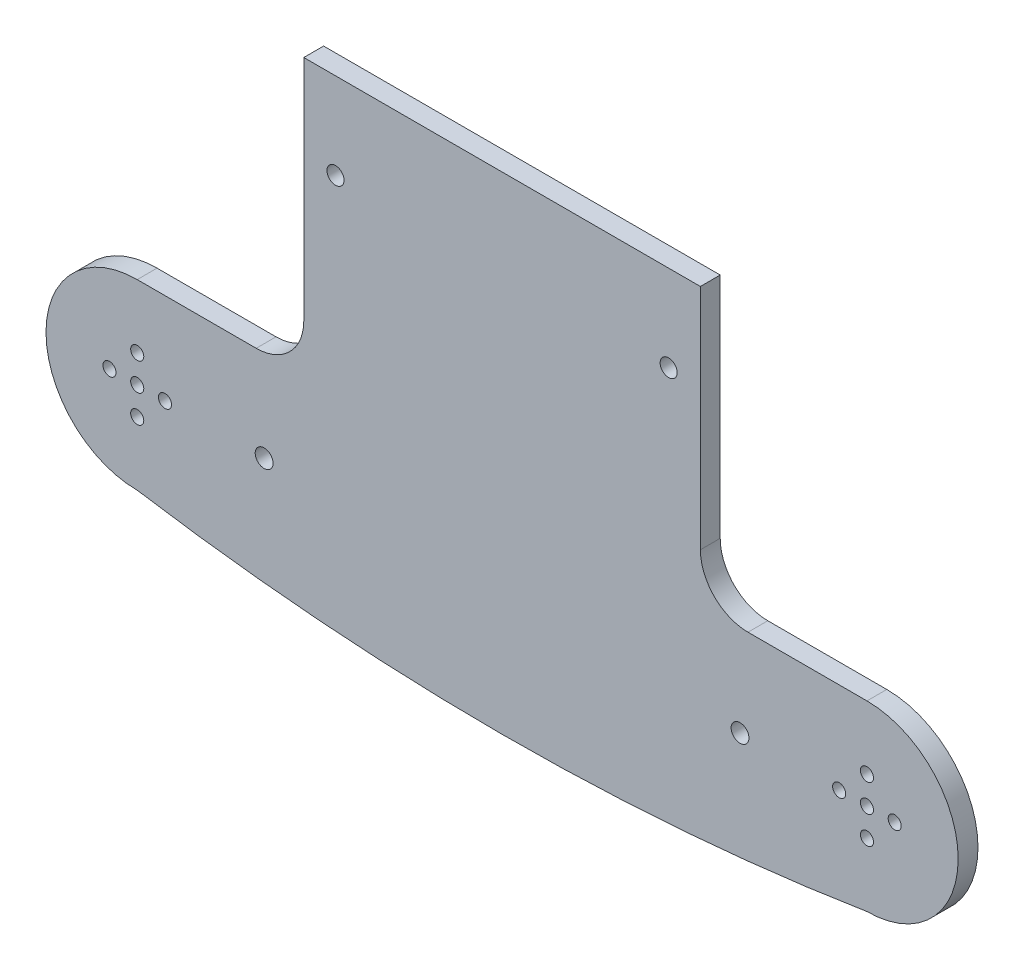
ISO-10303-21;
HEADER;
FILE_DESCRIPTION(('STEP AP214'),'2;1');
FILE_NAME('part.step','',(''),(''),'','','');
FILE_SCHEMA(('AUTOMOTIVE_DESIGN { 1 0 10303 214 1 1 1 1 }'));
ENDSEC;
DATA;
#1=APPLICATION_CONTEXT('core data for automotive mechanical design processes');
#2=APPLICATION_PROTOCOL_DEFINITION('international standard','automotive_design',2000,#1);
#3=PRODUCT_CONTEXT('',#1,'mechanical');
#4=PRODUCT('Part','Part','',(#3));
#5=PRODUCT_RELATED_PRODUCT_CATEGORY('part','',(#4));
#6=PRODUCT_DEFINITION_FORMATION('','',#4);
#7=PRODUCT_DEFINITION_CONTEXT('part definition',#1,'design');
#8=PRODUCT_DEFINITION('design','',#6,#7);
#9=PRODUCT_DEFINITION_SHAPE('','',#8);
#10=(LENGTH_UNIT() NAMED_UNIT(*) SI_UNIT(.MILLI.,.METRE.));
#11=(NAMED_UNIT(*) PLANE_ANGLE_UNIT() SI_UNIT($,.RADIAN.));
#12=(NAMED_UNIT(*) SI_UNIT($,.STERADIAN.) SOLID_ANGLE_UNIT());
#13=UNCERTAINTY_MEASURE_WITH_UNIT(LENGTH_MEASURE(1.E-05),#10,'distance_accuracy_value','');
#14=(GEOMETRIC_REPRESENTATION_CONTEXT(3) GLOBAL_UNCERTAINTY_ASSIGNED_CONTEXT((#13)) GLOBAL_UNIT_ASSIGNED_CONTEXT((#10,
#11,#12)) REPRESENTATION_CONTEXT('',''));
#15=CARTESIAN_POINT('',(0.,0.,0.));
#16=DIRECTION('',(0.,0.,1.));
#17=DIRECTION('',(1.,0.,0.));
#18=AXIS2_PLACEMENT_3D('',#15,#16,#17);
#19=CARTESIAN_POINT('',(-70.9669552143138,-59.5010284958712,-0.00999999999999959));
#20=DIRECTION('',(0.,-1.,0.));
#21=DIRECTION('',(0.,0.,-1.));
#22=AXIS2_PLACEMENT_3D('',#19,#20,#21);
#23=PLANE('',#22);
#24=DIRECTION('',(1.,0.,0.));
#25=VECTOR('',#24,1.);
#26=CARTESIAN_POINT('',(-92.,-59.5010284958712,5.));
#27=LINE('',#26,#25);
#28=CARTESIAN_POINT('',(-50.,-59.5010284958712,5.));
#29=VERTEX_POINT('',#28);
#30=CARTESIAN_POINT('',(50.,-59.5010284958712,5.));
#31=VERTEX_POINT('',#30);
#32=EDGE_CURVE('E300',#29,#31,#27,.T.);
#33=ORIENTED_EDGE('',*,*,#32,.T.);
#34=DIRECTION('',(0.,0.,1.));
#35=VECTOR('',#34,1.);
#36=CARTESIAN_POINT('',(50.,-59.5010284958712,5.));
#37=LINE('',#36,#35);
#38=CARTESIAN_POINT('',(50.,-59.5010284958712,0.));
#39=VERTEX_POINT('',#38);
#40=EDGE_CURVE('E288',#39,#31,#37,.T.);
#41=ORIENTED_EDGE('',*,*,#40,.F.);
#42=DIRECTION('',(1.,0.,0.));
#43=VECTOR('',#42,1.);
#44=CARTESIAN_POINT('',(-92.,-59.5010284958712,0.));
#45=LINE('',#44,#43);
#46=CARTESIAN_POINT('',(-50.,-59.5010284958712,0.));
#47=VERTEX_POINT('',#46);
#48=EDGE_CURVE('E296',#47,#39,#45,.T.);
#49=ORIENTED_EDGE('',*,*,#48,.F.);
#50=DIRECTION('',(0.,0.,-1.));
#51=VECTOR('',#50,1.);
#52=CARTESIAN_POINT('',(-50.,-59.5010284958712,5.));
#53=LINE('',#52,#51);
#54=EDGE_CURVE('E293',#29,#47,#53,.T.);
#55=ORIENTED_EDGE('',*,*,#54,.F.);
#56=EDGE_LOOP('',(#33,#41,#49,#55));
#57=FACE_BOUND('',#56,.T.);
#58=ADVANCED_FACE('F43',(#57),#23,.F.);
#59=CARTESIAN_POINT('',(-92.,0.,5.));
#60=DIRECTION('',(0.,0.,1.));
#61=DIRECTION('',(1.,0.,0.));
#62=AXIS2_PLACEMENT_3D('',#59,#60,#61);
#63=PLANE('',#62);
#64=ORIENTED_EDGE('',*,*,#32,.F.);
#65=DIRECTION('',(0.,-1.,0.));
#66=VECTOR('',#65,1.);
#67=CARTESIAN_POINT('',(-50.,-116.998971504128,5.));
#68=LINE('',#67,#66);
#69=CARTESIAN_POINT('',(-50.,-116.998971504128,5.));
#70=VERTEX_POINT('',#69);
#71=EDGE_CURVE('E97',#29,#70,#68,.T.);
#72=ORIENTED_EDGE('',*,*,#71,.T.);
#73=CARTESIAN_POINT('',(-62.,-116.998971504128,5.));
#74=DIRECTION('',(0.,0.,-1.));
#75=DIRECTION('',(1.,0.,0.));
#76=AXIS2_PLACEMENT_3D('',#73,#74,#75);
#77=CIRCLE('',#76,12.);
#78=CARTESIAN_POINT('',(-62.,-128.998971504128,5.));
#79=VERTEX_POINT('',#78);
#80=EDGE_CURVE('E92',#70,#79,#77,.T.);
#81=ORIENTED_EDGE('',*,*,#80,.T.);
#82=DIRECTION('',(-1.,0.,0.));
#83=VECTOR('',#82,1.);
#84=CARTESIAN_POINT('',(-62.,-128.998971504128,5.));
#85=LINE('',#84,#83);
#86=CARTESIAN_POINT('',(-92.,-128.998971504128,5.));
#87=VERTEX_POINT('',#86);
#88=EDGE_CURVE('E176',#79,#87,#85,.T.);
#89=ORIENTED_EDGE('',*,*,#88,.T.);
#90=CARTESIAN_POINT('',(-92.,-151.999999999999,5.));
#91=DIRECTION('',(0.,0.,1.));
#92=DIRECTION('',(-1.,0.,0.));
#93=AXIS2_PLACEMENT_3D('',#90,#91,#92);
#94=CIRCLE('',#93,23.0010284958712);
#95=CARTESIAN_POINT('',(-92.,-175.00102849587,5.));
#96=VERTEX_POINT('',#95);
#97=EDGE_CURVE('E143',#87,#96,#94,.T.);
#98=ORIENTED_EDGE('',*,*,#97,.T.);
#99=CARTESIAN_POINT('',(-1.11022302462516E-13,400.845641933042,5.));
#100=DIRECTION('',(0.,0.,1.));
#101=DIRECTION('',(1.,0.,0.));
#102=AXIS2_PLACEMENT_3D('',#99,#100,#101);
#103=CIRCLE('',#102,583.149541579229);
#104=CARTESIAN_POINT('',(91.9999999999998,-175.001028495871,5.));
#105=VERTEX_POINT('',#104);
#106=EDGE_CURVE('E171',#96,#105,#103,.T.);
#107=ORIENTED_EDGE('',*,*,#106,.T.);
#108=CARTESIAN_POINT('',(92.,-151.999999999999,5.));
#109=DIRECTION('',(0.,0.,1.));
#110=DIRECTION('',(1.,0.,0.));
#111=AXIS2_PLACEMENT_3D('',#108,#109,#110);
#112=CIRCLE('',#111,23.0010284958712);
#113=CARTESIAN_POINT('',(92.,-128.998971504128,5.));
#114=VERTEX_POINT('',#113);
#115=EDGE_CURVE('E168',#105,#114,#112,.T.);
#116=ORIENTED_EDGE('',*,*,#115,.T.);
#117=DIRECTION('',(-1.,0.,0.));
#118=VECTOR('',#117,1.);
#119=CARTESIAN_POINT('',(62.,-128.998971504128,5.));
#120=LINE('',#119,#118);
#121=CARTESIAN_POINT('',(62.,-128.998971504128,5.));
#122=VERTEX_POINT('',#121);
#123=EDGE_CURVE('E164',#114,#122,#120,.T.);
#124=ORIENTED_EDGE('',*,*,#123,.T.);
#125=CARTESIAN_POINT('',(62.,-116.998971504128,5.));
#126=DIRECTION('',(0.,0.,-1.));
#127=DIRECTION('',(-1.,0.,0.));
#128=AXIS2_PLACEMENT_3D('',#125,#126,#127);
#129=CIRCLE('',#128,12.);
#130=CARTESIAN_POINT('',(50.,-116.998971504128,5.));
#131=VERTEX_POINT('',#130);
#132=EDGE_CURVE('E161',#122,#131,#129,.T.);
#133=ORIENTED_EDGE('',*,*,#132,.T.);
#134=DIRECTION('',(0.,1.,0.));
#135=VECTOR('',#134,1.);
#136=CARTESIAN_POINT('',(50.,-116.998971504128,5.));
#137=LINE('',#136,#135);
#138=EDGE_CURVE('E165',#131,#31,#137,.T.);
#139=ORIENTED_EDGE('',*,*,#138,.T.);
#140=EDGE_LOOP('',(#64,#72,#81,#89,#98,#107,#116,#124,#133,#139));
#141=FACE_BOUND('',#140,.T.);
#142=CARTESIAN_POINT('',(-42.,-81.248971504128,5.));
#143=DIRECTION('',(0.,0.,1.));
#144=DIRECTION('',(-1.,0.,0.));
#145=AXIS2_PLACEMENT_3D('',#142,#143,#144);
#146=CIRCLE('',#145,2.15);
#147=CARTESIAN_POINT('',(-44.15,-81.248971504128,5.));
#148=VERTEX_POINT('',#147);
#149=EDGE_CURVE('E274',#148,#148,#146,.T.);
#150=ORIENTED_EDGE('',*,*,#149,.F.);
#151=EDGE_LOOP('',(#150));
#152=FACE_BOUND('',#151,.T.);
#153=CARTESIAN_POINT('',(42.,-81.248971504128,5.));
#154=DIRECTION('',(0.,0.,1.));
#155=DIRECTION('',(1.,0.,0.));
#156=AXIS2_PLACEMENT_3D('',#153,#154,#155);
#157=CIRCLE('',#156,2.15);
#158=CARTESIAN_POINT('',(44.15,-81.248971504128,5.));
#159=VERTEX_POINT('',#158);
#160=EDGE_CURVE('E54',#159,#159,#157,.T.);
#161=ORIENTED_EDGE('',*,*,#160,.F.);
#162=EDGE_LOOP('',(#161));
#163=FACE_BOUND('',#162,.T.);
#164=CARTESIAN_POINT('',(60.,-151.999999999999,5.));
#165=DIRECTION('',(0.,0.,1.));
#166=DIRECTION('',(-1.,0.,0.));
#167=AXIS2_PLACEMENT_3D('',#164,#165,#166);
#168=CIRCLE('',#167,2.25);
#169=CARTESIAN_POINT('',(57.75,-151.999999999999,5.));
#170=VERTEX_POINT('',#169);
#171=EDGE_CURVE('E266',#170,#170,#168,.T.);
#172=ORIENTED_EDGE('',*,*,#171,.F.);
#173=EDGE_LOOP('',(#172));
#174=FACE_BOUND('',#173,.T.);
#175=CARTESIAN_POINT('',(-60.,-151.999999999999,5.));
#176=DIRECTION('',(0.,0.,1.));
#177=DIRECTION('',(1.,0.,0.));
#178=AXIS2_PLACEMENT_3D('',#175,#176,#177);
#179=CIRCLE('',#178,2.25);
#180=CARTESIAN_POINT('',(-57.75,-151.999999999999,5.));
#181=VERTEX_POINT('',#180);
#182=EDGE_CURVE('E262',#181,#181,#179,.T.);
#183=ORIENTED_EDGE('',*,*,#182,.F.);
#184=EDGE_LOOP('',(#183));
#185=FACE_BOUND('',#184,.T.);
#186=CARTESIAN_POINT('',(-92.,-159.00102849587,5.));
#187=DIRECTION('',(0.,0.,1.));
#188=DIRECTION('',(-1.,0.,0.));
#189=AXIS2_PLACEMENT_3D('',#186,#187,#188);
#190=CIRCLE('',#189,1.65000000000001);
#191=CARTESIAN_POINT('',(-93.65,-159.00102849587,5.));
#192=VERTEX_POINT('',#191);
#193=EDGE_CURVE('E242',#192,#192,#190,.T.);
#194=ORIENTED_EDGE('',*,*,#193,.F.);
#195=EDGE_LOOP('',(#194));
#196=FACE_BOUND('',#195,.T.);
#197=CARTESIAN_POINT('',(-92.,-144.998971504128,5.));
#198=DIRECTION('',(0.,0.,1.));
#199=DIRECTION('',(-1.,0.,0.));
#200=AXIS2_PLACEMENT_3D('',#197,#198,#199);
#201=CIRCLE('',#200,1.65000000000001);
#202=CARTESIAN_POINT('',(-93.65,-144.998971504128,5.));
#203=VERTEX_POINT('',#202);
#204=EDGE_CURVE('E226',#203,#203,#201,.T.);
#205=ORIENTED_EDGE('',*,*,#204,.F.);
#206=EDGE_LOOP('',(#205));
#207=FACE_BOUND('',#206,.T.);
#208=CARTESIAN_POINT('',(99.0010284958712,-151.999999999999,5.));
#209=DIRECTION('',(0.,0.,1.));
#210=DIRECTION('',(1.,0.,0.));
#211=AXIS2_PLACEMENT_3D('',#208,#209,#210);
#212=CIRCLE('',#211,1.65000000000001);
#213=CARTESIAN_POINT('',(100.651028495871,-151.999999999999,5.));
#214=VERTEX_POINT('',#213);
#215=EDGE_CURVE('E210',#214,#214,#212,.T.);
#216=ORIENTED_EDGE('',*,*,#215,.F.);
#217=EDGE_LOOP('',(#216));
#218=FACE_BOUND('',#217,.T.);
#219=CARTESIAN_POINT('',(84.9989715041288,-151.999999999999,5.));
#220=DIRECTION('',(0.,0.,1.));
#221=DIRECTION('',(1.,0.,0.));
#222=AXIS2_PLACEMENT_3D('',#219,#220,#221);
#223=CIRCLE('',#222,1.65000000000001);
#224=CARTESIAN_POINT('',(86.6489715041288,-151.999999999999,5.));
#225=VERTEX_POINT('',#224);
#226=EDGE_CURVE('E194',#225,#225,#223,.T.);
#227=ORIENTED_EDGE('',*,*,#226,.F.);
#228=EDGE_LOOP('',(#227));
#229=FACE_BOUND('',#228,.T.);
#230=CARTESIAN_POINT('',(-92.,-151.999999999999,5.));
#231=DIRECTION('',(0.,0.,1.));
#232=DIRECTION('',(-1.,0.,0.));
#233=AXIS2_PLACEMENT_3D('',#230,#231,#232);
#234=CIRCLE('',#233,1.65);
#235=CARTESIAN_POINT('',(-93.65,-151.999999999999,5.));
#236=VERTEX_POINT('',#235);
#237=EDGE_CURVE('E186',#236,#236,#234,.T.);
#238=ORIENTED_EDGE('',*,*,#237,.F.);
#239=EDGE_LOOP('',(#238));
#240=FACE_BOUND('',#239,.T.);
#241=CARTESIAN_POINT('',(92.,-151.999999999999,5.));
#242=DIRECTION('',(0.,0.,1.));
#243=DIRECTION('',(1.,0.,0.));
#244=AXIS2_PLACEMENT_3D('',#241,#242,#243);
#245=CIRCLE('',#244,1.65);
#246=CARTESIAN_POINT('',(93.65,-151.999999999999,5.));
#247=VERTEX_POINT('',#246);
#248=EDGE_CURVE('E185',#247,#247,#245,.T.);
#249=ORIENTED_EDGE('',*,*,#248,.F.);
#250=EDGE_LOOP('',(#249));
#251=FACE_BOUND('',#250,.T.);
#252=CARTESIAN_POINT('',(92.,-159.00102849587,5.));
#253=DIRECTION('',(0.,0.,1.));
#254=DIRECTION('',(1.,0.,0.));
#255=AXIS2_PLACEMENT_3D('',#252,#253,#254);
#256=CIRCLE('',#255,1.65000000000001);
#257=CARTESIAN_POINT('',(93.65,-159.00102849587,5.));
#258=VERTEX_POINT('',#257);
#259=EDGE_CURVE('E202',#258,#258,#256,.T.);
#260=ORIENTED_EDGE('',*,*,#259,.F.);
#261=EDGE_LOOP('',(#260));
#262=FACE_BOUND('',#261,.T.);
#263=CARTESIAN_POINT('',(92.,-144.998971504128,5.));
#264=DIRECTION('',(0.,0.,1.));
#265=DIRECTION('',(1.,0.,0.));
#266=AXIS2_PLACEMENT_3D('',#263,#264,#265);
#267=CIRCLE('',#266,1.65000000000001);
#268=CARTESIAN_POINT('',(93.65,-144.998971504128,5.));
#269=VERTEX_POINT('',#268);
#270=EDGE_CURVE('E218',#269,#269,#267,.T.);
#271=ORIENTED_EDGE('',*,*,#270,.F.);
#272=EDGE_LOOP('',(#271));
#273=FACE_BOUND('',#272,.T.);
#274=CARTESIAN_POINT('',(-99.0010284958712,-151.999999999999,5.));
#275=DIRECTION('',(0.,0.,1.));
#276=DIRECTION('',(-1.,0.,0.));
#277=AXIS2_PLACEMENT_3D('',#274,#275,#276);
#278=CIRCLE('',#277,1.65000000000001);
#279=CARTESIAN_POINT('',(-100.651028495871,-151.999999999999,5.));
#280=VERTEX_POINT('',#279);
#281=EDGE_CURVE('E234',#280,#280,#278,.T.);
#282=ORIENTED_EDGE('',*,*,#281,.F.);
#283=EDGE_LOOP('',(#282));
#284=FACE_BOUND('',#283,.T.);
#285=CARTESIAN_POINT('',(-84.9989715041288,-151.999999999999,5.));
#286=DIRECTION('',(0.,0.,1.));
#287=DIRECTION('',(-1.,0.,0.));
#288=AXIS2_PLACEMENT_3D('',#285,#286,#287);
#289=CIRCLE('',#288,1.65000000000001);
#290=CARTESIAN_POINT('',(-86.6489715041288,-151.999999999999,5.));
#291=VERTEX_POINT('',#290);
#292=EDGE_CURVE('E250',#291,#291,#289,.T.);
#293=ORIENTED_EDGE('',*,*,#292,.F.);
#294=EDGE_LOOP('',(#293));
#295=FACE_BOUND('',#294,.T.);
#296=ADVANCED_FACE('F350',(#141,#152,#163,#174,#185,#196,#207,#218,#229,#240,#251,#262,#273,
#284,#295),#63,.T.);
#297=CARTESIAN_POINT('',(-92.,0.,0.));
#298=DIRECTION('',(0.,0.,1.));
#299=DIRECTION('',(1.,0.,0.));
#300=AXIS2_PLACEMENT_3D('',#297,#298,#299);
#301=PLANE('',#300);
#302=CARTESIAN_POINT('',(-42.,-81.248971504128,0.));
#303=DIRECTION('',(0.,0.,1.));
#304=DIRECTION('',(-1.,0.,0.));
#305=AXIS2_PLACEMENT_3D('',#302,#303,#304);
#306=CIRCLE('',#305,2.15);
#307=CARTESIAN_POINT('',(-44.15,-81.248971504128,0.));
#308=VERTEX_POINT('',#307);
#309=EDGE_CURVE('E281',#308,#308,#306,.T.);
#310=ORIENTED_EDGE('',*,*,#309,.T.);
#311=EDGE_LOOP('',(#310));
#312=FACE_BOUND('',#311,.T.);
#313=CARTESIAN_POINT('',(42.,-81.248971504128,0.));
#314=DIRECTION('',(0.,0.,1.));
#315=DIRECTION('',(1.,0.,0.));
#316=AXIS2_PLACEMENT_3D('',#313,#314,#315);
#317=CIRCLE('',#316,2.15);
#318=CARTESIAN_POINT('',(44.15,-81.248971504128,0.));
#319=VERTEX_POINT('',#318);
#320=EDGE_CURVE('E11',#319,#319,#317,.T.);
#321=ORIENTED_EDGE('',*,*,#320,.T.);
#322=EDGE_LOOP('',(#321));
#323=FACE_BOUND('',#322,.T.);
#324=CARTESIAN_POINT('',(60.,-151.999999999999,0.));
#325=DIRECTION('',(0.,0.,1.));
#326=DIRECTION('',(-1.,0.,0.));
#327=AXIS2_PLACEMENT_3D('',#324,#325,#326);
#328=CIRCLE('',#327,2.25);
#329=CARTESIAN_POINT('',(57.75,-151.999999999999,0.));
#330=VERTEX_POINT('',#329);
#331=EDGE_CURVE('E270',#330,#330,#328,.T.);
#332=ORIENTED_EDGE('',*,*,#331,.T.);
#333=EDGE_LOOP('',(#332));
#334=FACE_BOUND('',#333,.T.);
#335=CARTESIAN_POINT('',(-60.,-151.999999999999,0.));
#336=DIRECTION('',(0.,0.,1.));
#337=DIRECTION('',(1.,0.,0.));
#338=AXIS2_PLACEMENT_3D('',#335,#336,#337);
#339=CIRCLE('',#338,2.25);
#340=CARTESIAN_POINT('',(-57.75,-151.999999999999,0.));
#341=VERTEX_POINT('',#340);
#342=EDGE_CURVE('E258',#341,#341,#339,.T.);
#343=ORIENTED_EDGE('',*,*,#342,.T.);
#344=EDGE_LOOP('',(#343));
#345=FACE_BOUND('',#344,.T.);
#346=DIRECTION('',(0.,-1.,0.));
#347=VECTOR('',#346,1.);
#348=CARTESIAN_POINT('',(-50.,-116.998971504128,0.));
#349=LINE('',#348,#347);
#350=CARTESIAN_POINT('',(-50.,-116.998971504128,0.));
#351=VERTEX_POINT('',#350);
#352=EDGE_CURVE('E47',#47,#351,#349,.T.);
#353=ORIENTED_EDGE('',*,*,#352,.F.);
#354=ORIENTED_EDGE('',*,*,#48,.T.);
#355=DIRECTION('',(0.,1.,0.));
#356=VECTOR('',#355,1.);
#357=CARTESIAN_POINT('',(50.,-116.998971504128,0.));
#358=LINE('',#357,#356);
#359=CARTESIAN_POINT('',(50.,-116.998971504128,0.));
#360=VERTEX_POINT('',#359);
#361=EDGE_CURVE('E309',#360,#39,#358,.T.);
#362=ORIENTED_EDGE('',*,*,#361,.F.);
#363=CARTESIAN_POINT('',(62.,-116.998971504128,0.));
#364=DIRECTION('',(0.,0.,-1.));
#365=DIRECTION('',(-1.,0.,0.));
#366=AXIS2_PLACEMENT_3D('',#363,#364,#365);
#367=CIRCLE('',#366,12.);
#368=CARTESIAN_POINT('',(62.,-128.998971504128,0.));
#369=VERTEX_POINT('',#368);
#370=EDGE_CURVE('E105',#369,#360,#367,.T.);
#371=ORIENTED_EDGE('',*,*,#370,.F.);
#372=DIRECTION('',(-1.,0.,0.));
#373=VECTOR('',#372,1.);
#374=CARTESIAN_POINT('',(62.,-128.998971504128,0.));
#375=LINE('',#374,#373);
#376=CARTESIAN_POINT('',(92.,-128.998971504128,0.));
#377=VERTEX_POINT('',#376);
#378=EDGE_CURVE('E315',#377,#369,#375,.T.);
#379=ORIENTED_EDGE('',*,*,#378,.F.);
#380=CARTESIAN_POINT('',(92.,-151.999999999999,0.));
#381=DIRECTION('',(0.,0.,1.));
#382=DIRECTION('',(1.,0.,0.));
#383=AXIS2_PLACEMENT_3D('',#380,#381,#382);
#384=CIRCLE('',#383,23.0010284958712);
#385=CARTESIAN_POINT('',(91.9999999999998,-175.001028495871,0.));
#386=VERTEX_POINT('',#385);
#387=EDGE_CURVE('E155',#386,#377,#384,.T.);
#388=ORIENTED_EDGE('',*,*,#387,.F.);
#389=CARTESIAN_POINT('',(-1.11022302462516E-13,400.845641933042,0.));
#390=DIRECTION('',(0.,0.,1.));
#391=DIRECTION('',(1.,0.,0.));
#392=AXIS2_PLACEMENT_3D('',#389,#390,#391);
#393=CIRCLE('',#392,583.149541579229);
#394=CARTESIAN_POINT('',(-92.,-175.00102849587,0.));
#395=VERTEX_POINT('',#394);
#396=EDGE_CURVE('E151',#395,#386,#393,.T.);
#397=ORIENTED_EDGE('',*,*,#396,.F.);
#398=CARTESIAN_POINT('',(-92.,-151.999999999999,0.));
#399=DIRECTION('',(0.,0.,1.));
#400=DIRECTION('',(-1.,0.,0.));
#401=AXIS2_PLACEMENT_3D('',#398,#399,#400);
#402=CIRCLE('',#401,23.0010284958712);
#403=CARTESIAN_POINT('',(-92.,-128.998971504128,0.));
#404=VERTEX_POINT('',#403);
#405=EDGE_CURVE('E137',#404,#395,#402,.T.);
#406=ORIENTED_EDGE('',*,*,#405,.F.);
#407=DIRECTION('',(-1.,0.,0.));
#408=VECTOR('',#407,1.);
#409=CARTESIAN_POINT('',(-62.,-128.998971504128,0.));
#410=LINE('',#409,#408);
#411=CARTESIAN_POINT('',(-62.,-128.998971504128,0.));
#412=VERTEX_POINT('',#411);
#413=EDGE_CURVE('E125',#412,#404,#410,.T.);
#414=ORIENTED_EDGE('',*,*,#413,.F.);
#415=CARTESIAN_POINT('',(-62.,-116.998971504128,0.));
#416=DIRECTION('',(0.,0.,-1.));
#417=DIRECTION('',(1.,0.,0.));
#418=AXIS2_PLACEMENT_3D('',#415,#416,#417);
#419=CIRCLE('',#418,12.);
#420=EDGE_CURVE('E136',#351,#412,#419,.T.);
#421=ORIENTED_EDGE('',*,*,#420,.F.);
#422=EDGE_LOOP('',(#353,#354,#362,#371,#379,#388,#397,#406,#414,#421));
#423=FACE_BOUND('',#422,.T.);
#424=CARTESIAN_POINT('',(-92.,-151.999999999999,0.));
#425=DIRECTION('',(0.,0.,1.));
#426=DIRECTION('',(-1.,0.,0.));
#427=AXIS2_PLACEMENT_3D('',#424,#425,#426);
#428=CIRCLE('',#427,1.65);
#429=CARTESIAN_POINT('',(-93.65,-151.999999999999,0.));
#430=VERTEX_POINT('',#429);
#431=EDGE_CURVE('E181',#430,#430,#428,.T.);
#432=ORIENTED_EDGE('',*,*,#431,.T.);
#433=EDGE_LOOP('',(#432));
#434=FACE_BOUND('',#433,.T.);
#435=CARTESIAN_POINT('',(92.,-151.999999999999,0.));
#436=DIRECTION('',(0.,0.,1.));
#437=DIRECTION('',(1.,0.,0.));
#438=AXIS2_PLACEMENT_3D('',#435,#436,#437);
#439=CIRCLE('',#438,1.65);
#440=CARTESIAN_POINT('',(93.65,-151.999999999999,0.));
#441=VERTEX_POINT('',#440);
#442=EDGE_CURVE('E190',#441,#441,#439,.T.);
#443=ORIENTED_EDGE('',*,*,#442,.T.);
#444=EDGE_LOOP('',(#443));
#445=FACE_BOUND('',#444,.T.);
#446=CARTESIAN_POINT('',(84.9989715041288,-151.999999999999,0.));
#447=DIRECTION('',(0.,0.,1.));
#448=DIRECTION('',(1.,0.,0.));
#449=AXIS2_PLACEMENT_3D('',#446,#447,#448);
#450=CIRCLE('',#449,1.65000000000001);
#451=CARTESIAN_POINT('',(86.6489715041288,-151.999999999999,0.));
#452=VERTEX_POINT('',#451);
#453=EDGE_CURVE('E198',#452,#452,#450,.T.);
#454=ORIENTED_EDGE('',*,*,#453,.T.);
#455=EDGE_LOOP('',(#454));
#456=FACE_BOUND('',#455,.T.);
#457=CARTESIAN_POINT('',(92.,-159.00102849587,0.));
#458=DIRECTION('',(0.,0.,1.));
#459=DIRECTION('',(1.,0.,0.));
#460=AXIS2_PLACEMENT_3D('',#457,#458,#459);
#461=CIRCLE('',#460,1.65000000000001);
#462=CARTESIAN_POINT('',(93.65,-159.00102849587,0.));
#463=VERTEX_POINT('',#462);
#464=EDGE_CURVE('E206',#463,#463,#461,.T.);
#465=ORIENTED_EDGE('',*,*,#464,.T.);
#466=EDGE_LOOP('',(#465));
#467=FACE_BOUND('',#466,.T.);
#468=CARTESIAN_POINT('',(99.0010284958712,-151.999999999999,0.));
#469=DIRECTION('',(0.,0.,1.));
#470=DIRECTION('',(1.,0.,0.));
#471=AXIS2_PLACEMENT_3D('',#468,#469,#470);
#472=CIRCLE('',#471,1.65000000000001);
#473=CARTESIAN_POINT('',(100.651028495871,-151.999999999999,0.));
#474=VERTEX_POINT('',#473);
#475=EDGE_CURVE('E214',#474,#474,#472,.T.);
#476=ORIENTED_EDGE('',*,*,#475,.T.);
#477=EDGE_LOOP('',(#476));
#478=FACE_BOUND('',#477,.T.);
#479=CARTESIAN_POINT('',(92.,-144.998971504128,0.));
#480=DIRECTION('',(0.,0.,1.));
#481=DIRECTION('',(1.,0.,0.));
#482=AXIS2_PLACEMENT_3D('',#479,#480,#481);
#483=CIRCLE('',#482,1.65000000000001);
#484=CARTESIAN_POINT('',(93.65,-144.998971504128,0.));
#485=VERTEX_POINT('',#484);
#486=EDGE_CURVE('E222',#485,#485,#483,.T.);
#487=ORIENTED_EDGE('',*,*,#486,.T.);
#488=EDGE_LOOP('',(#487));
#489=FACE_BOUND('',#488,.T.);
#490=CARTESIAN_POINT('',(-92.,-144.998971504128,0.));
#491=DIRECTION('',(0.,0.,1.));
#492=DIRECTION('',(-1.,0.,0.));
#493=AXIS2_PLACEMENT_3D('',#490,#491,#492);
#494=CIRCLE('',#493,1.65000000000001);
#495=CARTESIAN_POINT('',(-93.65,-144.998971504128,0.));
#496=VERTEX_POINT('',#495);
#497=EDGE_CURVE('E230',#496,#496,#494,.T.);
#498=ORIENTED_EDGE('',*,*,#497,.T.);
#499=EDGE_LOOP('',(#498));
#500=FACE_BOUND('',#499,.T.);
#501=CARTESIAN_POINT('',(-99.0010284958712,-151.999999999999,0.));
#502=DIRECTION('',(0.,0.,1.));
#503=DIRECTION('',(-1.,0.,0.));
#504=AXIS2_PLACEMENT_3D('',#501,#502,#503);
#505=CIRCLE('',#504,1.65000000000001);
#506=CARTESIAN_POINT('',(-100.651028495871,-151.999999999999,0.));
#507=VERTEX_POINT('',#506);
#508=EDGE_CURVE('E238',#507,#507,#505,.T.);
#509=ORIENTED_EDGE('',*,*,#508,.T.);
#510=EDGE_LOOP('',(#509));
#511=FACE_BOUND('',#510,.T.);
#512=CARTESIAN_POINT('',(-92.,-159.00102849587,0.));
#513=DIRECTION('',(0.,0.,1.));
#514=DIRECTION('',(-1.,0.,0.));
#515=AXIS2_PLACEMENT_3D('',#512,#513,#514);
#516=CIRCLE('',#515,1.65000000000001);
#517=CARTESIAN_POINT('',(-93.65,-159.00102849587,0.));
#518=VERTEX_POINT('',#517);
#519=EDGE_CURVE('E246',#518,#518,#516,.T.);
#520=ORIENTED_EDGE('',*,*,#519,.T.);
#521=EDGE_LOOP('',(#520));
#522=FACE_BOUND('',#521,.T.);
#523=CARTESIAN_POINT('',(-84.9989715041288,-151.999999999999,0.));
#524=DIRECTION('',(0.,0.,1.));
#525=DIRECTION('',(-1.,0.,0.));
#526=AXIS2_PLACEMENT_3D('',#523,#524,#525);
#527=CIRCLE('',#526,1.65000000000001);
#528=CARTESIAN_POINT('',(-86.6489715041288,-151.999999999999,0.));
#529=VERTEX_POINT('',#528);
#530=EDGE_CURVE('E254',#529,#529,#527,.T.);
#531=ORIENTED_EDGE('',*,*,#530,.T.);
#532=EDGE_LOOP('',(#531));
#533=FACE_BOUND('',#532,.T.);
#534=ADVANCED_FACE('F148',(#312,#323,#334,#345,#423,#434,#445,#456,#467,#478,#489,#500,#511,
#522,#533),#301,.F.);
#535=CARTESIAN_POINT('',(-50.,-116.998971504128,5.));
#536=DIRECTION('',(1.,0.,0.));
#537=DIRECTION('',(0.,0.,-1.));
#538=AXIS2_PLACEMENT_3D('',#535,#536,#537);
#539=PLANE('',#538);
#540=ORIENTED_EDGE('',*,*,#71,.F.);
#541=ORIENTED_EDGE('',*,*,#54,.T.);
#542=ORIENTED_EDGE('',*,*,#352,.T.);
#543=DIRECTION('',(0.,0.,-1.));
#544=VECTOR('',#543,1.);
#545=CARTESIAN_POINT('',(-50.,-116.998971504128,5.));
#546=LINE('',#545,#544);
#547=EDGE_CURVE('E292',#70,#351,#546,.T.);
#548=ORIENTED_EDGE('',*,*,#547,.F.);
#549=EDGE_LOOP('',(#540,#541,#542,#548));
#550=FACE_BOUND('',#549,.T.);
#551=ADVANCED_FACE('F45',(#550),#539,.F.);
#552=CARTESIAN_POINT('',(-62.,-116.998971504128,5.));
#553=DIRECTION('',(0.,0.,-1.));
#554=DIRECTION('',(-1.,0.,0.));
#555=AXIS2_PLACEMENT_3D('',#552,#553,#554);
#556=CYLINDRICAL_SURFACE('',#555,12.);
#557=ORIENTED_EDGE('',*,*,#420,.T.);
#558=DIRECTION('',(0.,0.,-1.));
#559=VECTOR('',#558,1.);
#560=CARTESIAN_POINT('',(-62.,-128.998971504128,5.));
#561=LINE('',#560,#559);
#562=EDGE_CURVE('E131',#79,#412,#561,.T.);
#563=ORIENTED_EDGE('',*,*,#562,.F.);
#564=ORIENTED_EDGE('',*,*,#80,.F.);
#565=ORIENTED_EDGE('',*,*,#547,.T.);
#566=EDGE_LOOP('',(#557,#563,#564,#565));
#567=FACE_BOUND('',#566,.T.);
#568=ADVANCED_FACE('F355',(#567),#556,.F.);
#569=CARTESIAN_POINT('',(-62.,-128.998971504128,5.));
#570=DIRECTION('',(0.,-1.,0.));
#571=DIRECTION('',(0.,0.,-1.));
#572=AXIS2_PLACEMENT_3D('',#569,#570,#571);
#573=PLANE('',#572);
#574=ORIENTED_EDGE('',*,*,#413,.T.);
#575=DIRECTION('',(0.,0.,-1.));
#576=VECTOR('',#575,1.);
#577=CARTESIAN_POINT('',(-92.,-128.998971504128,5.));
#578=LINE('',#577,#576);
#579=EDGE_CURVE('E129',#87,#404,#578,.T.);
#580=ORIENTED_EDGE('',*,*,#579,.F.);
#581=ORIENTED_EDGE('',*,*,#88,.F.);
#582=ORIENTED_EDGE('',*,*,#562,.T.);
#583=EDGE_LOOP('',(#574,#580,#581,#582));
#584=FACE_BOUND('',#583,.T.);
#585=ADVANCED_FACE('F127',(#584),#573,.F.);
#586=CARTESIAN_POINT('',(-92.,-151.999999999999,5.));
#587=DIRECTION('',(0.,0.,-1.));
#588=DIRECTION('',(-1.,0.,0.));
#589=AXIS2_PLACEMENT_3D('',#586,#587,#588);
#590=CYLINDRICAL_SURFACE('',#589,23.0010284958712);
#591=ORIENTED_EDGE('',*,*,#405,.T.);
#592=DIRECTION('',(0.,0.,-1.));
#593=VECTOR('',#592,1.);
#594=CARTESIAN_POINT('',(-92.,-175.00102849587,5.));
#595=LINE('',#594,#593);
#596=EDGE_CURVE('E145',#96,#395,#595,.T.);
#597=ORIENTED_EDGE('',*,*,#596,.F.);
#598=ORIENTED_EDGE('',*,*,#97,.F.);
#599=ORIENTED_EDGE('',*,*,#579,.T.);
#600=EDGE_LOOP('',(#591,#597,#598,#599));
#601=FACE_BOUND('',#600,.T.);
#602=ADVANCED_FACE('F140',(#601),#590,.T.);
#603=CARTESIAN_POINT('',(-1.11022302462516E-13,400.845641933042,5.));
#604=DIRECTION('',(0.,0.,-1.));
#605=DIRECTION('',(-1.,0.,0.));
#606=AXIS2_PLACEMENT_3D('',#603,#604,#605);
#607=CYLINDRICAL_SURFACE('',#606,583.149541579229);
#608=ORIENTED_EDGE('',*,*,#396,.T.);
#609=DIRECTION('',(0.,0.,-1.));
#610=VECTOR('',#609,1.);
#611=CARTESIAN_POINT('',(91.9999999999998,-175.001028495871,5.));
#612=LINE('',#611,#610);
#613=EDGE_CURVE('E331',#105,#386,#612,.T.);
#614=ORIENTED_EDGE('',*,*,#613,.F.);
#615=ORIENTED_EDGE('',*,*,#106,.F.);
#616=ORIENTED_EDGE('',*,*,#596,.T.);
#617=EDGE_LOOP('',(#608,#614,#615,#616));
#618=FACE_BOUND('',#617,.T.);
#619=ADVANCED_FACE('F362',(#618),#607,.T.);
#620=CARTESIAN_POINT('',(92.,-151.999999999999,5.));
#621=DIRECTION('',(0.,0.,-1.));
#622=DIRECTION('',(-1.,0.,0.));
#623=AXIS2_PLACEMENT_3D('',#620,#621,#622);
#624=CYLINDRICAL_SURFACE('',#623,23.0010284958712);
#625=ORIENTED_EDGE('',*,*,#387,.T.);
#626=DIRECTION('',(0.,0.,-1.));
#627=VECTOR('',#626,1.);
#628=CARTESIAN_POINT('',(92.,-128.998971504128,5.));
#629=LINE('',#628,#627);
#630=EDGE_CURVE('E328',#114,#377,#629,.T.);
#631=ORIENTED_EDGE('',*,*,#630,.F.);
#632=ORIENTED_EDGE('',*,*,#115,.F.);
#633=ORIENTED_EDGE('',*,*,#613,.T.);
#634=EDGE_LOOP('',(#625,#631,#632,#633));
#635=FACE_BOUND('',#634,.T.);
#636=ADVANCED_FACE('F326',(#635),#624,.T.);
#637=CARTESIAN_POINT('',(62.,-128.998971504128,5.));
#638=DIRECTION('',(0.,-1.,0.));
#639=DIRECTION('',(0.,0.,-1.));
#640=AXIS2_PLACEMENT_3D('',#637,#638,#639);
#641=PLANE('',#640);
#642=ORIENTED_EDGE('',*,*,#378,.T.);
#643=DIRECTION('',(0.,0.,-1.));
#644=VECTOR('',#643,1.);
#645=CARTESIAN_POINT('',(62.,-128.998971504128,5.));
#646=LINE('',#645,#644);
#647=EDGE_CURVE('E337',#122,#369,#646,.T.);
#648=ORIENTED_EDGE('',*,*,#647,.F.);
#649=ORIENTED_EDGE('',*,*,#123,.F.);
#650=ORIENTED_EDGE('',*,*,#630,.T.);
#651=EDGE_LOOP('',(#642,#648,#649,#650));
#652=FACE_BOUND('',#651,.T.);
#653=ADVANCED_FACE('F334',(#652),#641,.F.);
#654=CARTESIAN_POINT('',(62.,-116.998971504128,5.));
#655=DIRECTION('',(0.,0.,-1.));
#656=DIRECTION('',(-1.,0.,0.));
#657=AXIS2_PLACEMENT_3D('',#654,#655,#656);
#658=CYLINDRICAL_SURFACE('',#657,12.);
#659=ORIENTED_EDGE('',*,*,#370,.T.);
#660=DIRECTION('',(0.,0.,-1.));
#661=VECTOR('',#660,1.);
#662=CARTESIAN_POINT('',(50.,-116.998971504128,5.));
#663=LINE('',#662,#661);
#664=EDGE_CURVE('E307',#131,#360,#663,.T.);
#665=ORIENTED_EDGE('',*,*,#664,.F.);
#666=ORIENTED_EDGE('',*,*,#132,.F.);
#667=ORIENTED_EDGE('',*,*,#647,.T.);
#668=EDGE_LOOP('',(#659,#665,#666,#667));
#669=FACE_BOUND('',#668,.T.);
#670=ADVANCED_FACE('F367',(#669),#658,.F.);
#671=CARTESIAN_POINT('',(50.,-116.998971504128,5.));
#672=DIRECTION('',(-1.,0.,0.));
#673=DIRECTION('',(0.,0.,1.));
#674=AXIS2_PLACEMENT_3D('',#671,#672,#673);
#675=PLANE('',#674);
#676=ORIENTED_EDGE('',*,*,#361,.T.);
#677=ORIENTED_EDGE('',*,*,#40,.T.);
#678=ORIENTED_EDGE('',*,*,#138,.F.);
#679=ORIENTED_EDGE('',*,*,#664,.T.);
#680=EDGE_LOOP('',(#676,#677,#678,#679));
#681=FACE_BOUND('',#680,.T.);
#682=ADVANCED_FACE('F346',(#681),#675,.F.);
#683=CARTESIAN_POINT('',(-92.,-151.999999999999,5.));
#684=DIRECTION('',(0.,0.,-1.));
#685=DIRECTION('',(-1.,0.,0.));
#686=AXIS2_PLACEMENT_3D('',#683,#684,#685);
#687=CYLINDRICAL_SURFACE('',#686,1.65);
#688=ORIENTED_EDGE('',*,*,#237,.T.);
#689=EDGE_LOOP('',(#688));
#690=FACE_BOUND('',#689,.T.);
#691=ORIENTED_EDGE('',*,*,#431,.F.);
#692=EDGE_LOOP('',(#691));
#693=FACE_BOUND('',#692,.T.);
#694=ADVANCED_FACE('F375',(#690,#693),#687,.F.);
#695=CARTESIAN_POINT('',(92.,-151.999999999999,5.));
#696=DIRECTION('',(0.,0.,-1.));
#697=DIRECTION('',(-1.,0.,0.));
#698=AXIS2_PLACEMENT_3D('',#695,#696,#697);
#699=CYLINDRICAL_SURFACE('',#698,1.65);
#700=ORIENTED_EDGE('',*,*,#248,.T.);
#701=EDGE_LOOP('',(#700));
#702=FACE_BOUND('',#701,.T.);
#703=ORIENTED_EDGE('',*,*,#442,.F.);
#704=EDGE_LOOP('',(#703));
#705=FACE_BOUND('',#704,.T.);
#706=ADVANCED_FACE('F437',(#702,#705),#699,.F.);
#707=CARTESIAN_POINT('',(84.9989715041288,-151.999999999999,5.));
#708=DIRECTION('',(0.,0.,-1.));
#709=DIRECTION('',(-1.,0.,0.));
#710=AXIS2_PLACEMENT_3D('',#707,#708,#709);
#711=CYLINDRICAL_SURFACE('',#710,1.65000000000001);
#712=ORIENTED_EDGE('',*,*,#226,.T.);
#713=EDGE_LOOP('',(#712));
#714=FACE_BOUND('',#713,.T.);
#715=ORIENTED_EDGE('',*,*,#453,.F.);
#716=EDGE_LOOP('',(#715));
#717=FACE_BOUND('',#716,.T.);
#718=ADVANCED_FACE('F433',(#714,#717),#711,.F.);
#719=CARTESIAN_POINT('',(92.,-159.00102849587,5.));
#720=DIRECTION('',(0.,0.,-1.));
#721=DIRECTION('',(-1.,0.,0.));
#722=AXIS2_PLACEMENT_3D('',#719,#720,#721);
#723=CYLINDRICAL_SURFACE('',#722,1.65000000000001);
#724=ORIENTED_EDGE('',*,*,#259,.T.);
#725=EDGE_LOOP('',(#724));
#726=FACE_BOUND('',#725,.T.);
#727=ORIENTED_EDGE('',*,*,#464,.F.);
#728=EDGE_LOOP('',(#727));
#729=FACE_BOUND('',#728,.T.);
#730=ADVANCED_FACE('F429',(#726,#729),#723,.F.);
#731=CARTESIAN_POINT('',(99.0010284958712,-151.999999999999,5.));
#732=DIRECTION('',(0.,0.,-1.));
#733=DIRECTION('',(-1.,0.,0.));
#734=AXIS2_PLACEMENT_3D('',#731,#732,#733);
#735=CYLINDRICAL_SURFACE('',#734,1.65000000000001);
#736=ORIENTED_EDGE('',*,*,#215,.T.);
#737=EDGE_LOOP('',(#736));
#738=FACE_BOUND('',#737,.T.);
#739=ORIENTED_EDGE('',*,*,#475,.F.);
#740=EDGE_LOOP('',(#739));
#741=FACE_BOUND('',#740,.T.);
#742=ADVANCED_FACE('F425',(#738,#741),#735,.F.);
#743=CARTESIAN_POINT('',(92.,-144.998971504128,5.));
#744=DIRECTION('',(0.,0.,-1.));
#745=DIRECTION('',(-1.,0.,0.));
#746=AXIS2_PLACEMENT_3D('',#743,#744,#745);
#747=CYLINDRICAL_SURFACE('',#746,1.65000000000001);
#748=ORIENTED_EDGE('',*,*,#270,.T.);
#749=EDGE_LOOP('',(#748));
#750=FACE_BOUND('',#749,.T.);
#751=ORIENTED_EDGE('',*,*,#486,.F.);
#752=EDGE_LOOP('',(#751));
#753=FACE_BOUND('',#752,.T.);
#754=ADVANCED_FACE('F421',(#750,#753),#747,.F.);
#755=CARTESIAN_POINT('',(-92.,-144.998971504128,5.));
#756=DIRECTION('',(0.,0.,-1.));
#757=DIRECTION('',(-1.,0.,0.));
#758=AXIS2_PLACEMENT_3D('',#755,#756,#757);
#759=CYLINDRICAL_SURFACE('',#758,1.65000000000001);
#760=ORIENTED_EDGE('',*,*,#204,.T.);
#761=EDGE_LOOP('',(#760));
#762=FACE_BOUND('',#761,.T.);
#763=ORIENTED_EDGE('',*,*,#497,.F.);
#764=EDGE_LOOP('',(#763));
#765=FACE_BOUND('',#764,.T.);
#766=ADVANCED_FACE('F417',(#762,#765),#759,.F.);
#767=CARTESIAN_POINT('',(-99.0010284958712,-151.999999999999,5.));
#768=DIRECTION('',(0.,0.,-1.));
#769=DIRECTION('',(-1.,0.,0.));
#770=AXIS2_PLACEMENT_3D('',#767,#768,#769);
#771=CYLINDRICAL_SURFACE('',#770,1.65000000000001);
#772=ORIENTED_EDGE('',*,*,#281,.T.);
#773=EDGE_LOOP('',(#772));
#774=FACE_BOUND('',#773,.T.);
#775=ORIENTED_EDGE('',*,*,#508,.F.);
#776=EDGE_LOOP('',(#775));
#777=FACE_BOUND('',#776,.T.);
#778=ADVANCED_FACE('F413',(#774,#777),#771,.F.);
#779=CARTESIAN_POINT('',(-92.,-159.00102849587,5.));
#780=DIRECTION('',(0.,0.,-1.));
#781=DIRECTION('',(-1.,0.,0.));
#782=AXIS2_PLACEMENT_3D('',#779,#780,#781);
#783=CYLINDRICAL_SURFACE('',#782,1.65000000000001);
#784=ORIENTED_EDGE('',*,*,#193,.T.);
#785=EDGE_LOOP('',(#784));
#786=FACE_BOUND('',#785,.T.);
#787=ORIENTED_EDGE('',*,*,#519,.F.);
#788=EDGE_LOOP('',(#787));
#789=FACE_BOUND('',#788,.T.);
#790=ADVANCED_FACE('F409',(#786,#789),#783,.F.);
#791=CARTESIAN_POINT('',(-84.9989715041288,-151.999999999999,5.));
#792=DIRECTION('',(0.,0.,-1.));
#793=DIRECTION('',(-1.,0.,0.));
#794=AXIS2_PLACEMENT_3D('',#791,#792,#793);
#795=CYLINDRICAL_SURFACE('',#794,1.65000000000001);
#796=ORIENTED_EDGE('',*,*,#292,.T.);
#797=EDGE_LOOP('',(#796));
#798=FACE_BOUND('',#797,.T.);
#799=ORIENTED_EDGE('',*,*,#530,.F.);
#800=EDGE_LOOP('',(#799));
#801=FACE_BOUND('',#800,.T.);
#802=ADVANCED_FACE('F405',(#798,#801),#795,.F.);
#803=CARTESIAN_POINT('',(-60.,-151.999999999999,0.));
#804=DIRECTION('',(0.,0.,1.));
#805=DIRECTION('',(1.,0.,0.));
#806=AXIS2_PLACEMENT_3D('',#803,#804,#805);
#807=CYLINDRICAL_SURFACE('',#806,2.25);
#808=ORIENTED_EDGE('',*,*,#342,.F.);
#809=EDGE_LOOP('',(#808));
#810=FACE_BOUND('',#809,.T.);
#811=ORIENTED_EDGE('',*,*,#182,.T.);
#812=EDGE_LOOP('',(#811));
#813=FACE_BOUND('',#812,.T.);
#814=ADVANCED_FACE('F401',(#810,#813),#807,.F.);
#815=CARTESIAN_POINT('',(60.,-151.999999999999,0.));
#816=DIRECTION('',(0.,0.,1.));
#817=DIRECTION('',(1.,0.,0.));
#818=AXIS2_PLACEMENT_3D('',#815,#816,#817);
#819=CYLINDRICAL_SURFACE('',#818,2.25);
#820=ORIENTED_EDGE('',*,*,#331,.F.);
#821=EDGE_LOOP('',(#820));
#822=FACE_BOUND('',#821,.T.);
#823=ORIENTED_EDGE('',*,*,#171,.T.);
#824=EDGE_LOOP('',(#823));
#825=FACE_BOUND('',#824,.T.);
#826=ADVANCED_FACE('F393',(#822,#825),#819,.F.);
#827=CARTESIAN_POINT('',(42.,-81.248971504128,0.));
#828=DIRECTION('',(0.,0.,1.));
#829=DIRECTION('',(1.,0.,0.));
#830=AXIS2_PLACEMENT_3D('',#827,#828,#829);
#831=CYLINDRICAL_SURFACE('',#830,2.15);
#832=ORIENTED_EDGE('',*,*,#320,.F.);
#833=EDGE_LOOP('',(#832));
#834=FACE_BOUND('',#833,.T.);
#835=ORIENTED_EDGE('',*,*,#160,.T.);
#836=EDGE_LOOP('',(#835));
#837=FACE_BOUND('',#836,.T.);
#838=ADVANCED_FACE('F388',(#834,#837),#831,.F.);
#839=CARTESIAN_POINT('',(-42.,-81.248971504128,0.));
#840=DIRECTION('',(0.,0.,1.));
#841=DIRECTION('',(1.,0.,0.));
#842=AXIS2_PLACEMENT_3D('',#839,#840,#841);
#843=CYLINDRICAL_SURFACE('',#842,2.15);
#844=ORIENTED_EDGE('',*,*,#309,.F.);
#845=EDGE_LOOP('',(#844));
#846=FACE_BOUND('',#845,.T.);
#847=ORIENTED_EDGE('',*,*,#149,.T.);
#848=EDGE_LOOP('',(#847));
#849=FACE_BOUND('',#848,.T.);
#850=ADVANCED_FACE('F380',(#846,#849),#843,.F.);
#851=CLOSED_SHELL('',(#58,#296,#534,#551,#568,#585,#602,#619,#636,#653,#670,#682,#694,#706,#718,
#730,#742,#754,#766,#778,#790,#802,#814,#826,#838,#850));
#852=MANIFOLD_SOLID_BREP('B2',#851);
#853=ADVANCED_BREP_SHAPE_REPRESENTATION('',(#18,#852),#14);
#854=SHAPE_DEFINITION_REPRESENTATION(#9,#853);
ENDSEC;
END-ISO-10303-21;
